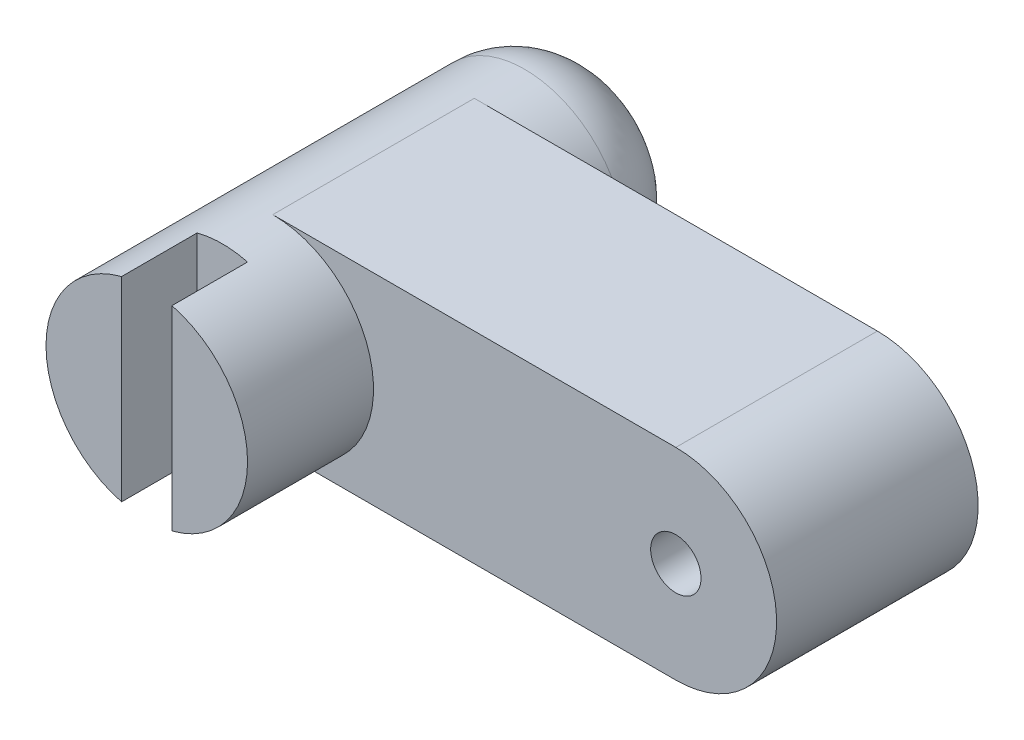
ISO-10303-21;
HEADER;
FILE_DESCRIPTION(('STEP AP214'),'2;1');
FILE_NAME('part.step','',(''),(''),'','','');
FILE_SCHEMA(('AUTOMOTIVE_DESIGN { 1 0 10303 214 1 1 1 1 }'));
ENDSEC;
DATA;
#1=APPLICATION_CONTEXT('core data for automotive mechanical design processes');
#2=APPLICATION_PROTOCOL_DEFINITION('international standard','automotive_design',2000,#1);
#3=PRODUCT_CONTEXT('',#1,'mechanical');
#4=PRODUCT('Part','Part','',(#3));
#5=PRODUCT_RELATED_PRODUCT_CATEGORY('part','',(#4));
#6=PRODUCT_DEFINITION_FORMATION('','',#4);
#7=PRODUCT_DEFINITION_CONTEXT('part definition',#1,'design');
#8=PRODUCT_DEFINITION('design','',#6,#7);
#9=PRODUCT_DEFINITION_SHAPE('','',#8);
#10=(LENGTH_UNIT() NAMED_UNIT(*) SI_UNIT(.MILLI.,.METRE.));
#11=(NAMED_UNIT(*) PLANE_ANGLE_UNIT() SI_UNIT($,.RADIAN.));
#12=(NAMED_UNIT(*) SI_UNIT($,.STERADIAN.) SOLID_ANGLE_UNIT());
#13=UNCERTAINTY_MEASURE_WITH_UNIT(LENGTH_MEASURE(1.E-05),#10,'distance_accuracy_value','');
#14=(GEOMETRIC_REPRESENTATION_CONTEXT(3) GLOBAL_UNCERTAINTY_ASSIGNED_CONTEXT((#13)) GLOBAL_UNIT_ASSIGNED_CONTEXT((#10,
#11,#12)) REPRESENTATION_CONTEXT('',''));
#15=CARTESIAN_POINT('',(0.,0.,0.));
#16=DIRECTION('',(0.,0.,1.));
#17=DIRECTION('',(1.,0.,0.));
#18=AXIS2_PLACEMENT_3D('',#15,#16,#17);
#19=CARTESIAN_POINT('',(0.,0.,9.));
#20=DIRECTION('',(0.,0.,-1.));
#21=DIRECTION('',(-1.,0.,0.));
#22=AXIS2_PLACEMENT_3D('',#19,#20,#21);
#23=CYLINDRICAL_SURFACE('',#22,2.);
#24=CARTESIAN_POINT('',(0.,0.,7.5));
#25=DIRECTION('',(0.,0.,-1.));
#26=DIRECTION('',(-1.,0.,0.));
#27=AXIS2_PLACEMENT_3D('',#24,#25,#26);
#28=CIRCLE('',#27,2.);
#29=CARTESIAN_POINT('',(-0.5,1.93649167310371,7.5));
#30=VERTEX_POINT('',#29);
#31=CARTESIAN_POINT('',(0.5,1.93649167310371,7.5));
#32=VERTEX_POINT('',#31);
#33=EDGE_CURVE('E166',#30,#32,#28,.T.);
#34=ORIENTED_EDGE('',*,*,#33,.T.);
#35=DIRECTION('',(0.,0.,-1.));
#36=VECTOR('',#35,1.);
#37=CARTESIAN_POINT('',(0.5,1.93649167310371,9.));
#38=LINE('',#37,#36);
#39=CARTESIAN_POINT('',(0.5,1.93649167310371,9.));
#40=VERTEX_POINT('',#39);
#41=EDGE_CURVE('E173',#32,#40,#38,.F.);
#42=ORIENTED_EDGE('',*,*,#41,.T.);
#43=CARTESIAN_POINT('',(0.,0.,9.));
#44=DIRECTION('',(0.,0.,1.));
#45=DIRECTION('',(1.,0.,0.));
#46=AXIS2_PLACEMENT_3D('',#43,#44,#45);
#47=CIRCLE('',#46,2.);
#48=CARTESIAN_POINT('',(0.5,-1.93649167310371,9.));
#49=VERTEX_POINT('',#48);
#50=EDGE_CURVE('E182',#49,#40,#47,.T.);
#51=ORIENTED_EDGE('',*,*,#50,.F.);
#52=DIRECTION('',(0.,0.,-1.));
#53=VECTOR('',#52,1.);
#54=CARTESIAN_POINT('',(0.5,-1.93649167310371,9.));
#55=LINE('',#54,#53);
#56=CARTESIAN_POINT('',(0.5,-1.93649167310371,7.5));
#57=VERTEX_POINT('',#56);
#58=EDGE_CURVE('E176',#49,#57,#55,.T.);
#59=ORIENTED_EDGE('',*,*,#58,.T.);
#60=CARTESIAN_POINT('',(-0.5,-1.93649167310371,7.5));
#61=VERTEX_POINT('',#60);
#62=EDGE_CURVE('E163',#57,#61,#28,.T.);
#63=ORIENTED_EDGE('',*,*,#62,.T.);
#64=DIRECTION('',(0.,0.,-1.));
#65=VECTOR('',#64,1.);
#66=CARTESIAN_POINT('',(-0.5,-1.93649167310371,9.));
#67=LINE('',#66,#65);
#68=CARTESIAN_POINT('',(-0.5,-1.93649167310371,9.));
#69=VERTEX_POINT('',#68);
#70=EDGE_CURVE('E167',#61,#69,#67,.F.);
#71=ORIENTED_EDGE('',*,*,#70,.T.);
#72=CARTESIAN_POINT('',(-0.5,1.93649167310371,9.));
#73=VERTEX_POINT('',#72);
#74=EDGE_CURVE('E184',#73,#69,#47,.T.);
#75=ORIENTED_EDGE('',*,*,#74,.F.);
#76=DIRECTION('',(0.,0.,-1.));
#77=VECTOR('',#76,1.);
#78=CARTESIAN_POINT('',(-0.5,1.93649167310371,9.));
#79=LINE('',#78,#77);
#80=EDGE_CURVE('E170',#73,#30,#79,.T.);
#81=ORIENTED_EDGE('',*,*,#80,.T.);
#82=EDGE_LOOP('',(#34,#42,#51,#59,#63,#71,#75,#81));
#83=FACE_BOUND('',#82,.T.);
#84=CARTESIAN_POINT('',(0.,0.,1.5));
#85=DIRECTION('',(0.,0.,1.));
#86=DIRECTION('',(1.,0.,0.));
#87=AXIS2_PLACEMENT_3D('',#84,#85,#86);
#88=CIRCLE('',#87,2.);
#89=CARTESIAN_POINT('',(2.,0.,1.5));
#90=VERTEX_POINT('',#89);
#91=EDGE_CURVE('E11',#90,#90,#88,.T.);
#92=ORIENTED_EDGE('',*,*,#91,.T.);
#93=EDGE_LOOP('',(#92));
#94=FACE_BOUND('',#93,.T.);
#95=CARTESIAN_POINT('',(0.,0.,2.5));
#96=DIRECTION('',(0.,0.,1.));
#97=DIRECTION('',(1.,0.,0.));
#98=AXIS2_PLACEMENT_3D('',#95,#96,#97);
#99=CIRCLE('',#98,2.);
#100=CARTESIAN_POINT('',(0.,-2.,2.5));
#101=VERTEX_POINT('',#100);
#102=CARTESIAN_POINT('',(0.,2.,2.5));
#103=VERTEX_POINT('',#102);
#104=EDGE_CURVE('E150',#101,#103,#99,.T.);
#105=ORIENTED_EDGE('',*,*,#104,.F.);
#106=DIRECTION('',(0.,0.,1.));
#107=VECTOR('',#106,1.);
#108=CARTESIAN_POINT('',(0.,-2.,2.5));
#109=LINE('',#108,#107);
#110=CARTESIAN_POINT('',(0.,-2.,6.5));
#111=VERTEX_POINT('',#110);
#112=EDGE_CURVE('E115',#101,#111,#109,.T.);
#113=ORIENTED_EDGE('',*,*,#112,.T.);
#114=CARTESIAN_POINT('',(0.,0.,6.5));
#115=DIRECTION('',(0.,0.,-1.));
#116=DIRECTION('',(-1.,0.,0.));
#117=AXIS2_PLACEMENT_3D('',#114,#115,#116);
#118=CIRCLE('',#117,2.);
#119=CARTESIAN_POINT('',(0.,2.,6.5));
#120=VERTEX_POINT('',#119);
#121=EDGE_CURVE('E59',#120,#111,#118,.T.);
#122=ORIENTED_EDGE('',*,*,#121,.F.);
#123=DIRECTION('',(0.,0.,1.));
#124=VECTOR('',#123,1.);
#125=CARTESIAN_POINT('',(0.,2.,2.5));
#126=LINE('',#125,#124);
#127=EDGE_CURVE('E54',#103,#120,#126,.T.);
#128=ORIENTED_EDGE('',*,*,#127,.F.);
#129=EDGE_LOOP('',(#105,#113,#122,#128));
#130=FACE_BOUND('',#129,.T.);
#131=ADVANCED_FACE('F39',(#83,#94,#130),#23,.T.);
#132=CARTESIAN_POINT('',(0.,0.,9.));
#133=DIRECTION('',(0.,0.,-1.));
#134=DIRECTION('',(-1.,0.,0.));
#135=AXIS2_PLACEMENT_3D('',#132,#133,#134);
#136=CYLINDRICAL_SURFACE('',#135,0.5);
#137=CARTESIAN_POINT('',(0.,0.,7.5));
#138=DIRECTION('',(0.,0.,-1.));
#139=DIRECTION('',(-1.,0.,0.));
#140=AXIS2_PLACEMENT_3D('',#137,#138,#139);
#141=CIRCLE('',#140,0.5);
#142=CARTESIAN_POINT('',(-0.5,0.,7.5));
#143=VERTEX_POINT('',#142);
#144=CARTESIAN_POINT('',(0.5,0.,7.5));
#145=VERTEX_POINT('',#144);
#146=EDGE_CURVE('E47',#143,#145,#141,.T.);
#147=ORIENTED_EDGE('',*,*,#146,.F.);
#148=EDGE_CURVE('E185',#145,#143,#141,.T.);
#149=ORIENTED_EDGE('',*,*,#148,.F.);
#150=EDGE_LOOP('',(#147,#149));
#151=FACE_BOUND('',#150,.T.);
#152=CARTESIAN_POINT('',(0.,0.,0.));
#153=DIRECTION('',(0.,0.,1.));
#154=DIRECTION('',(1.,0.,0.));
#155=AXIS2_PLACEMENT_3D('',#152,#153,#154);
#156=CIRCLE('',#155,0.5);
#157=CARTESIAN_POINT('',(0.5,0.,0.));
#158=VERTEX_POINT('',#157);
#159=EDGE_CURVE('E179',#158,#158,#156,.T.);
#160=ORIENTED_EDGE('',*,*,#159,.F.);
#161=EDGE_LOOP('',(#160));
#162=FACE_BOUND('',#161,.T.);
#163=ADVANCED_FACE('F207',(#151,#162),#136,.F.);
#164=CARTESIAN_POINT('',(0.,0.,9.));
#165=DIRECTION('',(0.,0.,1.));
#166=DIRECTION('',(1.,0.,0.));
#167=AXIS2_PLACEMENT_3D('',#164,#165,#166);
#168=PLANE('',#167);
#169=DIRECTION('',(0.,1.,0.));
#170=VECTOR('',#169,1.);
#171=CARTESIAN_POINT('',(0.5,-2.08235495099108,9.));
#172=LINE('',#171,#170);
#173=EDGE_CURVE('E152',#49,#40,#172,.T.);
#174=ORIENTED_EDGE('',*,*,#173,.F.);
#175=ORIENTED_EDGE('',*,*,#50,.T.);
#176=EDGE_LOOP('',(#174,#175));
#177=FACE_BOUND('',#176,.T.);
#178=ADVANCED_FACE('F210',(#177),#168,.T.);
#179=DIRECTION('',(0.,-1.,0.));
#180=VECTOR('',#179,1.);
#181=CARTESIAN_POINT('',(-0.5,-2.08235495099108,9.));
#182=LINE('',#181,#180);
#183=EDGE_CURVE('E157',#73,#69,#182,.T.);
#184=ORIENTED_EDGE('',*,*,#183,.F.);
#185=ORIENTED_EDGE('',*,*,#74,.T.);
#186=EDGE_LOOP('',(#184,#185));
#187=FACE_BOUND('',#186,.T.);
#188=ADVANCED_FACE('F194',(#187),#168,.T.);
#189=CARTESIAN_POINT('',(0.5,-2.08235495099108,7.5));
#190=DIRECTION('',(1.,0.,0.));
#191=DIRECTION('',(0.,0.,-1.));
#192=AXIS2_PLACEMENT_3D('',#189,#190,#191);
#193=PLANE('',#192);
#194=DIRECTION('',(0.,1.,0.));
#195=VECTOR('',#194,1.);
#196=CARTESIAN_POINT('',(0.5,-2.08235495099108,7.5));
#197=LINE('',#196,#195);
#198=EDGE_CURVE('E153',#145,#32,#197,.T.);
#199=ORIENTED_EDGE('',*,*,#198,.F.);
#200=EDGE_CURVE('E156',#57,#145,#197,.T.);
#201=ORIENTED_EDGE('',*,*,#200,.F.);
#202=ORIENTED_EDGE('',*,*,#58,.F.);
#203=ORIENTED_EDGE('',*,*,#173,.T.);
#204=ORIENTED_EDGE('',*,*,#41,.F.);
#205=EDGE_LOOP('',(#199,#201,#202,#203,#204));
#206=FACE_BOUND('',#205,.T.);
#207=ADVANCED_FACE('F249',(#206),#193,.F.);
#208=CARTESIAN_POINT('',(-0.5,-2.08235495099108,7.5));
#209=DIRECTION('',(-1.,0.,0.));
#210=DIRECTION('',(0.,0.,1.));
#211=AXIS2_PLACEMENT_3D('',#208,#209,#210);
#212=PLANE('',#211);
#213=DIRECTION('',(0.,-1.,0.));
#214=VECTOR('',#213,1.);
#215=CARTESIAN_POINT('',(-0.5,-2.08235495099108,7.5));
#216=LINE('',#215,#214);
#217=EDGE_CURVE('E158',#143,#61,#216,.T.);
#218=ORIENTED_EDGE('',*,*,#217,.F.);
#219=EDGE_CURVE('E160',#30,#143,#216,.T.);
#220=ORIENTED_EDGE('',*,*,#219,.F.);
#221=ORIENTED_EDGE('',*,*,#80,.F.);
#222=ORIENTED_EDGE('',*,*,#183,.T.);
#223=ORIENTED_EDGE('',*,*,#70,.F.);
#224=EDGE_LOOP('',(#218,#220,#221,#222,#223));
#225=FACE_BOUND('',#224,.T.);
#226=ADVANCED_FACE('F200',(#225),#212,.F.);
#227=CARTESIAN_POINT('',(0.,0.,7.5));
#228=DIRECTION('',(0.,0.,-1.));
#229=DIRECTION('',(-1.,0.,0.));
#230=AXIS2_PLACEMENT_3D('',#227,#228,#229);
#231=PLANE('',#230);
#232=ORIENTED_EDGE('',*,*,#219,.T.);
#233=ORIENTED_EDGE('',*,*,#146,.T.);
#234=ORIENTED_EDGE('',*,*,#198,.T.);
#235=ORIENTED_EDGE('',*,*,#33,.F.);
#236=EDGE_LOOP('',(#232,#233,#234,#235));
#237=FACE_BOUND('',#236,.T.);
#238=ADVANCED_FACE('F205',(#237),#231,.F.);
#239=ORIENTED_EDGE('',*,*,#200,.T.);
#240=ORIENTED_EDGE('',*,*,#148,.T.);
#241=ORIENTED_EDGE('',*,*,#217,.T.);
#242=ORIENTED_EDGE('',*,*,#62,.F.);
#243=EDGE_LOOP('',(#239,#240,#241,#242));
#244=FACE_BOUND('',#243,.T.);
#245=ADVANCED_FACE('F216',(#244),#231,.F.);
#246=CARTESIAN_POINT('',(0.,0.,1.5));
#247=DIRECTION('',(0.,0.,1.));
#248=DIRECTION('',(1.,0.,0.));
#249=AXIS2_PLACEMENT_3D('',#246,#247,#248);
#250=DEGENERATE_TOROIDAL_SURFACE('',#249,0.5,1.5,.T.);
#251=ORIENTED_EDGE('',*,*,#159,.T.);
#252=EDGE_LOOP('',(#251));
#253=FACE_BOUND('',#252,.T.);
#254=ORIENTED_EDGE('',*,*,#91,.F.);
#255=EDGE_LOOP('',(#254));
#256=FACE_BOUND('',#255,.T.);
#257=ADVANCED_FACE('F41',(#253,#256),#250,.T.);
#258=CARTESIAN_POINT('',(0.,2.,2.5));
#259=DIRECTION('',(0.,0.,1.));
#260=DIRECTION('',(1.,0.,0.));
#261=AXIS2_PLACEMENT_3D('',#258,#259,#260);
#262=PLANE('',#261);
#263=DIRECTION('',(-1.,0.,0.));
#264=VECTOR('',#263,1.);
#265=CARTESIAN_POINT('',(0.,2.,2.5));
#266=LINE('',#265,#264);
#267=CARTESIAN_POINT('',(8.,2.,2.5));
#268=VERTEX_POINT('',#267);
#269=EDGE_CURVE('E125',#268,#103,#266,.T.);
#270=ORIENTED_EDGE('',*,*,#269,.F.);
#271=CARTESIAN_POINT('',(8.,0.,2.5));
#272=DIRECTION('',(0.,0.,-1.));
#273=DIRECTION('',(-1.,0.,0.));
#274=AXIS2_PLACEMENT_3D('',#271,#272,#273);
#275=CIRCLE('',#274,2.);
#276=CARTESIAN_POINT('',(8.,-2.,2.5));
#277=VERTEX_POINT('',#276);
#278=EDGE_CURVE('E122',#268,#277,#275,.T.);
#279=ORIENTED_EDGE('',*,*,#278,.T.);
#280=DIRECTION('',(-1.,0.,0.));
#281=VECTOR('',#280,1.);
#282=CARTESIAN_POINT('',(0.,-2.,2.5));
#283=LINE('',#282,#281);
#284=EDGE_CURVE('E109',#277,#101,#283,.T.);
#285=ORIENTED_EDGE('',*,*,#284,.T.);
#286=ORIENTED_EDGE('',*,*,#104,.T.);
#287=EDGE_LOOP('',(#270,#279,#285,#286));
#288=FACE_BOUND('',#287,.T.);
#289=CARTESIAN_POINT('',(8.,0.,2.5));
#290=DIRECTION('',(0.,0.,-1.));
#291=DIRECTION('',(-1.,0.,0.));
#292=AXIS2_PLACEMENT_3D('',#289,#290,#291);
#293=CIRCLE('',#292,0.500000000000001);
#294=CARTESIAN_POINT('',(7.5,0.,2.5));
#295=VERTEX_POINT('',#294);
#296=EDGE_CURVE('E136',#295,#295,#293,.T.);
#297=ORIENTED_EDGE('',*,*,#296,.F.);
#298=EDGE_LOOP('',(#297));
#299=FACE_BOUND('',#298,.T.);
#300=ADVANCED_FACE('F129',(#288,#299),#262,.F.);
#301=CARTESIAN_POINT('',(0.,2.,6.5));
#302=DIRECTION('',(0.,0.,-1.));
#303=DIRECTION('',(-1.,0.,0.));
#304=AXIS2_PLACEMENT_3D('',#301,#302,#303);
#305=PLANE('',#304);
#306=DIRECTION('',(1.,0.,0.));
#307=VECTOR('',#306,1.);
#308=CARTESIAN_POINT('',(0.,-2.,6.5));
#309=LINE('',#308,#307);
#310=CARTESIAN_POINT('',(8.,-2.,6.5));
#311=VERTEX_POINT('',#310);
#312=EDGE_CURVE('E126',#111,#311,#309,.T.);
#313=ORIENTED_EDGE('',*,*,#312,.T.);
#314=CARTESIAN_POINT('',(8.,0.,6.5));
#315=DIRECTION('',(0.,0.,-1.));
#316=DIRECTION('',(-1.,0.,0.));
#317=AXIS2_PLACEMENT_3D('',#314,#315,#316);
#318=CIRCLE('',#317,2.);
#319=CARTESIAN_POINT('',(8.,2.,6.5));
#320=VERTEX_POINT('',#319);
#321=EDGE_CURVE('E118',#320,#311,#318,.T.);
#322=ORIENTED_EDGE('',*,*,#321,.F.);
#323=DIRECTION('',(1.,0.,0.));
#324=VECTOR('',#323,1.);
#325=CARTESIAN_POINT('',(0.,2.,6.5));
#326=LINE('',#325,#324);
#327=EDGE_CURVE('E142',#120,#320,#326,.T.);
#328=ORIENTED_EDGE('',*,*,#327,.F.);
#329=ORIENTED_EDGE('',*,*,#121,.T.);
#330=EDGE_LOOP('',(#313,#322,#328,#329));
#331=FACE_BOUND('',#330,.T.);
#332=CARTESIAN_POINT('',(8.,0.,6.5));
#333=DIRECTION('',(0.,0.,-1.));
#334=DIRECTION('',(-1.,0.,0.));
#335=AXIS2_PLACEMENT_3D('',#332,#333,#334);
#336=CIRCLE('',#335,0.500000000000001);
#337=CARTESIAN_POINT('',(7.5,0.,6.5));
#338=VERTEX_POINT('',#337);
#339=EDGE_CURVE('E132',#338,#338,#336,.T.);
#340=ORIENTED_EDGE('',*,*,#339,.T.);
#341=EDGE_LOOP('',(#340));
#342=FACE_BOUND('',#341,.T.);
#343=ADVANCED_FACE('F223',(#331,#342),#305,.F.);
#344=CARTESIAN_POINT('',(0.,2.,0.));
#345=DIRECTION('',(0.,-1.,0.));
#346=DIRECTION('',(0.,0.,-1.));
#347=AXIS2_PLACEMENT_3D('',#344,#345,#346);
#348=PLANE('',#347);
#349=ORIENTED_EDGE('',*,*,#269,.T.);
#350=ORIENTED_EDGE('',*,*,#127,.T.);
#351=ORIENTED_EDGE('',*,*,#327,.T.);
#352=DIRECTION('',(0.,0.,-1.));
#353=VECTOR('',#352,1.);
#354=CARTESIAN_POINT('',(8.,2.,2.5));
#355=LINE('',#354,#353);
#356=EDGE_CURVE('E145',#320,#268,#355,.T.);
#357=ORIENTED_EDGE('',*,*,#356,.T.);
#358=EDGE_LOOP('',(#349,#350,#351,#357));
#359=FACE_BOUND('',#358,.T.);
#360=ADVANCED_FACE('F220',(#359),#348,.F.);
#361=CARTESIAN_POINT('',(0.,-2.,0.));
#362=DIRECTION('',(0.,-1.,0.));
#363=DIRECTION('',(0.,0.,-1.));
#364=AXIS2_PLACEMENT_3D('',#361,#362,#363);
#365=PLANE('',#364);
#366=ORIENTED_EDGE('',*,*,#284,.F.);
#367=DIRECTION('',(0.,0.,-1.));
#368=VECTOR('',#367,1.);
#369=CARTESIAN_POINT('',(8.,-2.,2.5));
#370=LINE('',#369,#368);
#371=EDGE_CURVE('E113',#311,#277,#370,.T.);
#372=ORIENTED_EDGE('',*,*,#371,.F.);
#373=ORIENTED_EDGE('',*,*,#312,.F.);
#374=ORIENTED_EDGE('',*,*,#112,.F.);
#375=EDGE_LOOP('',(#366,#372,#373,#374));
#376=FACE_BOUND('',#375,.T.);
#377=ADVANCED_FACE('F111',(#376),#365,.T.);
#378=CARTESIAN_POINT('',(8.,0.,6.5));
#379=DIRECTION('',(0.,0.,-1.));
#380=DIRECTION('',(-1.,0.,0.));
#381=AXIS2_PLACEMENT_3D('',#378,#379,#380);
#382=CYLINDRICAL_SURFACE('',#381,0.500000000000001);
#383=ORIENTED_EDGE('',*,*,#296,.T.);
#384=EDGE_LOOP('',(#383));
#385=FACE_BOUND('',#384,.T.);
#386=ORIENTED_EDGE('',*,*,#339,.F.);
#387=EDGE_LOOP('',(#386));
#388=FACE_BOUND('',#387,.T.);
#389=ADVANCED_FACE('F229',(#385,#388),#382,.F.);
#390=CARTESIAN_POINT('',(8.,0.,6.5));
#391=DIRECTION('',(0.,0.,-1.));
#392=DIRECTION('',(-1.,0.,0.));
#393=AXIS2_PLACEMENT_3D('',#390,#391,#392);
#394=CYLINDRICAL_SURFACE('',#393,2.);
#395=ORIENTED_EDGE('',*,*,#356,.F.);
#396=ORIENTED_EDGE('',*,*,#321,.T.);
#397=ORIENTED_EDGE('',*,*,#371,.T.);
#398=ORIENTED_EDGE('',*,*,#278,.F.);
#399=EDGE_LOOP('',(#395,#396,#397,#398));
#400=FACE_BOUND('',#399,.T.);
#401=ADVANCED_FACE('F121',(#400),#394,.T.);
#402=CLOSED_SHELL('',(#131,#163,#178,#188,#207,#226,#238,#245,#257,#300,#343,#360,#377,#389,#401));
#403=MANIFOLD_SOLID_BREP('B2',#402);
#404=ADVANCED_BREP_SHAPE_REPRESENTATION('',(#18,#403),#14);
#405=SHAPE_DEFINITION_REPRESENTATION(#9,#404);
ENDSEC;
END-ISO-10303-21;
